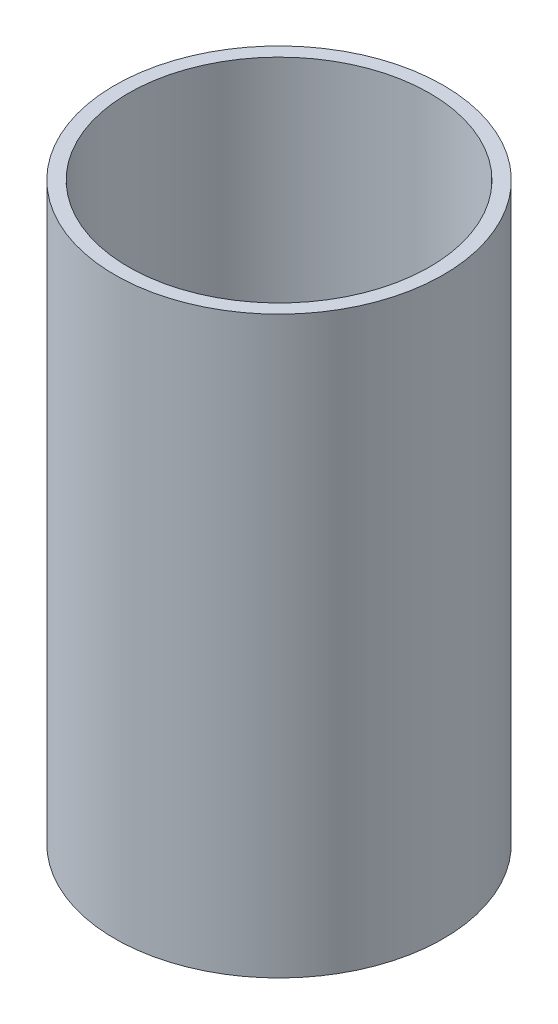
ISO-10303-21;
HEADER;
FILE_DESCRIPTION(('STEP AP214'),'2;1');
FILE_NAME('part.step','',(''),(''),'','','');
FILE_SCHEMA(('AUTOMOTIVE_DESIGN { 1 0 10303 214 1 1 1 1 }'));
ENDSEC;
DATA;
#1=APPLICATION_CONTEXT('core data for automotive mechanical design processes');
#2=APPLICATION_PROTOCOL_DEFINITION('international standard','automotive_design',2000,#1);
#3=PRODUCT_CONTEXT('',#1,'mechanical');
#4=PRODUCT('Part','Part','',(#3));
#5=PRODUCT_RELATED_PRODUCT_CATEGORY('part','',(#4));
#6=PRODUCT_DEFINITION_FORMATION('','',#4);
#7=PRODUCT_DEFINITION_CONTEXT('part definition',#1,'design');
#8=PRODUCT_DEFINITION('design','',#6,#7);
#9=PRODUCT_DEFINITION_SHAPE('','',#8);
#10=(LENGTH_UNIT() NAMED_UNIT(*) SI_UNIT(.MILLI.,.METRE.));
#11=(NAMED_UNIT(*) PLANE_ANGLE_UNIT() SI_UNIT($,.RADIAN.));
#12=(NAMED_UNIT(*) SI_UNIT($,.STERADIAN.) SOLID_ANGLE_UNIT());
#13=UNCERTAINTY_MEASURE_WITH_UNIT(LENGTH_MEASURE(1.E-05),#10,'distance_accuracy_value','');
#14=(GEOMETRIC_REPRESENTATION_CONTEXT(3) GLOBAL_UNCERTAINTY_ASSIGNED_CONTEXT((#13)) GLOBAL_UNIT_ASSIGNED_CONTEXT((#10,
#11,#12)) REPRESENTATION_CONTEXT('',''));
#15=CARTESIAN_POINT('',(0.,0.,0.));
#16=DIRECTION('',(0.,0.,1.));
#17=DIRECTION('',(1.,0.,0.));
#18=AXIS2_PLACEMENT_3D('',#15,#16,#17);
#19=CARTESIAN_POINT('',(0.,21.,0.));
#20=DIRECTION('',(0.,1.,0.));
#21=DIRECTION('',(0.,0.,1.));
#22=AXIS2_PLACEMENT_3D('',#19,#20,#21);
#23=PLANE('',#22);
#24=CARTESIAN_POINT('',(0.,21.,0.));
#25=DIRECTION('',(0.,1.,0.));
#26=DIRECTION('',(0.,0.,1.));
#27=AXIS2_PLACEMENT_3D('',#24,#25,#26);
#28=CIRCLE('',#27,12.);
#29=CARTESIAN_POINT('',(0.,21.,-12.));
#30=VERTEX_POINT('',#29);
#31=EDGE_CURVE('E10',#30,#30,#28,.T.);
#32=ORIENTED_EDGE('',*,*,#31,.T.);
#33=EDGE_LOOP('',(#32));
#34=FACE_BOUND('',#33,.T.);
#35=CARTESIAN_POINT('',(0.,21.,0.));
#36=DIRECTION('',(0.,1.,0.));
#37=DIRECTION('',(0.,0.,1.));
#38=AXIS2_PLACEMENT_3D('',#35,#36,#37);
#39=CIRCLE('',#38,11.);
#40=CARTESIAN_POINT('',(0.,21.,-11.));
#41=VERTEX_POINT('',#40);
#42=EDGE_CURVE('E52',#41,#41,#39,.T.);
#43=ORIENTED_EDGE('',*,*,#42,.F.);
#44=EDGE_LOOP('',(#43));
#45=FACE_BOUND('',#44,.T.);
#46=ADVANCED_FACE('F41',(#34,#45),#23,.T.);
#47=CARTESIAN_POINT('',(0.,-21.,0.));
#48=DIRECTION('',(0.,1.,0.));
#49=DIRECTION('',(0.,0.,1.));
#50=AXIS2_PLACEMENT_3D('',#47,#48,#49);
#51=PLANE('',#50);
#52=CARTESIAN_POINT('',(0.,-21.,0.));
#53=DIRECTION('',(0.,1.,0.));
#54=DIRECTION('',(0.,0.,1.));
#55=AXIS2_PLACEMENT_3D('',#52,#53,#54);
#56=CIRCLE('',#55,12.);
#57=CARTESIAN_POINT('',(0.,-21.,-12.));
#58=VERTEX_POINT('',#57);
#59=EDGE_CURVE('E45',#58,#58,#56,.T.);
#60=ORIENTED_EDGE('',*,*,#59,.F.);
#61=EDGE_LOOP('',(#60));
#62=FACE_BOUND('',#61,.T.);
#63=CARTESIAN_POINT('',(0.,-21.,0.));
#64=DIRECTION('',(0.,1.,0.));
#65=DIRECTION('',(0.,0.,1.));
#66=AXIS2_PLACEMENT_3D('',#63,#64,#65);
#67=CIRCLE('',#66,11.);
#68=CARTESIAN_POINT('',(0.,-21.,-11.));
#69=VERTEX_POINT('',#68);
#70=EDGE_CURVE('E54',#69,#69,#67,.T.);
#71=ORIENTED_EDGE('',*,*,#70,.T.);
#72=EDGE_LOOP('',(#71));
#73=FACE_BOUND('',#72,.T.);
#74=ADVANCED_FACE('F64',(#62,#73),#51,.F.);
#75=CARTESIAN_POINT('',(0.,21.,0.));
#76=DIRECTION('',(0.,-1.,0.));
#77=DIRECTION('',(0.,0.,-1.));
#78=AXIS2_PLACEMENT_3D('',#75,#76,#77);
#79=CYLINDRICAL_SURFACE('',#78,12.);
#80=CARTESIAN_POINT('',(0.,21.,-12.));
#81=CARTESIAN_POINT('',(0.,20.5625,-12.));
#82=CARTESIAN_POINT('',(0.,20.125,-12.));
#83=CARTESIAN_POINT('',(0.,19.25,-12.));
#84=CARTESIAN_POINT('',(0.,18.8125,-12.));
#85=CARTESIAN_POINT('',(0.,17.9375,-12.));
#86=CARTESIAN_POINT('',(0.,17.5,-12.));
#87=CARTESIAN_POINT('',(0.,16.625,-12.));
#88=CARTESIAN_POINT('',(0.,16.1875,-12.));
#89=CARTESIAN_POINT('',(0.,15.3125,-12.));
#90=CARTESIAN_POINT('',(0.,14.875,-12.));
#91=CARTESIAN_POINT('',(0.,14.,-12.));
#92=CARTESIAN_POINT('',(0.,13.5625,-12.));
#93=CARTESIAN_POINT('',(0.,12.6875,-12.));
#94=CARTESIAN_POINT('',(0.,12.25,-12.));
#95=CARTESIAN_POINT('',(0.,11.375,-12.));
#96=CARTESIAN_POINT('',(0.,10.9375,-12.));
#97=CARTESIAN_POINT('',(0.,10.0625,-12.));
#98=CARTESIAN_POINT('',(0.,9.625,-12.));
#99=CARTESIAN_POINT('',(0.,8.75,-12.));
#100=CARTESIAN_POINT('',(0.,8.3125,-12.));
#101=CARTESIAN_POINT('',(0.,7.4375,-12.));
#102=CARTESIAN_POINT('',(0.,7.,-12.));
#103=CARTESIAN_POINT('',(0.,6.125,-12.));
#104=CARTESIAN_POINT('',(0.,5.6875,-12.));
#105=CARTESIAN_POINT('',(0.,4.8125,-12.));
#106=CARTESIAN_POINT('',(0.,4.375,-12.));
#107=CARTESIAN_POINT('',(0.,3.5,-12.));
#108=CARTESIAN_POINT('',(0.,3.0625,-12.));
#109=CARTESIAN_POINT('',(0.,2.1875,-12.));
#110=CARTESIAN_POINT('',(0.,1.75,-12.));
#111=CARTESIAN_POINT('',(0.,0.874999999999997,-12.));
#112=CARTESIAN_POINT('',(0.,0.437499999999997,-12.));
#113=CARTESIAN_POINT('',(0.,-0.437500000000004,-12.));
#114=CARTESIAN_POINT('',(0.,-0.875000000000004,-12.));
#115=CARTESIAN_POINT('',(0.,-1.75000000000001,-12.));
#116=CARTESIAN_POINT('',(0.,-2.18750000000001,-12.));
#117=CARTESIAN_POINT('',(0.,-3.0625,-12.));
#118=CARTESIAN_POINT('',(0.,-3.5,-12.));
#119=CARTESIAN_POINT('',(0.,-4.375,-12.));
#120=CARTESIAN_POINT('',(0.,-4.8125,-12.));
#121=CARTESIAN_POINT('',(0.,-5.68750000000001,-12.));
#122=CARTESIAN_POINT('',(0.,-6.12500000000001,-12.));
#123=CARTESIAN_POINT('',(0.,-7.00000000000001,-12.));
#124=CARTESIAN_POINT('',(0.,-7.4375,-12.));
#125=CARTESIAN_POINT('',(0.,-8.3125,-12.));
#126=CARTESIAN_POINT('',(0.,-8.75,-12.));
#127=CARTESIAN_POINT('',(0.,-9.625,-12.));
#128=CARTESIAN_POINT('',(0.,-10.0625,-12.));
#129=CARTESIAN_POINT('',(0.,-10.9375,-12.));
#130=CARTESIAN_POINT('',(0.,-11.375,-12.));
#131=CARTESIAN_POINT('',(0.,-12.25,-12.));
#132=CARTESIAN_POINT('',(0.,-12.6875,-12.));
#133=CARTESIAN_POINT('',(0.,-13.5625,-12.));
#134=CARTESIAN_POINT('',(0.,-14.,-12.));
#135=CARTESIAN_POINT('',(0.,-14.875,-12.));
#136=CARTESIAN_POINT('',(0.,-15.3125,-12.));
#137=CARTESIAN_POINT('',(0.,-16.1875,-12.));
#138=CARTESIAN_POINT('',(0.,-16.625,-12.));
#139=CARTESIAN_POINT('',(0.,-17.5,-12.));
#140=CARTESIAN_POINT('',(0.,-17.9375,-12.));
#141=CARTESIAN_POINT('',(0.,-18.8125,-12.));
#142=CARTESIAN_POINT('',(0.,-19.25,-12.));
#143=CARTESIAN_POINT('',(0.,-20.125,-12.));
#144=CARTESIAN_POINT('',(0.,-20.5625,-12.));
#145=CARTESIAN_POINT('',(0.,-21.,-12.));
#146=B_SPLINE_CURVE_WITH_KNOTS('',3,(#80,#81,#82,#83,#84,#85,#86,#87,#88,#89,#90,#91,#92,#93,
#94,#95,#96,#97,#98,#99,#100,#101,#102,#103,#104,#105,#106,#107,#108,#109,#110,#111,#112,#113,
#114,#115,#116,#117,#118,#119,#120,#121,#122,#123,#124,#125,#126,#127,#128,#129,#130,#131,#132,
#133,#134,#135,#136,#137,#138,#139,#140,#141,#142,#143,#144,#145),.UNSPECIFIED.,.F.,.F.,(4,2,2,
2,2,2,2,2,2,2,2,2,2,2,2,2,2,2,2,2,2,2,2,2,2,2,2,2,2,2,2,2,4),(0.,1.3125,2.625,3.9375,5.25,
6.5625,7.875,9.1875,10.5,11.8125,13.125,14.4375,15.75,17.0625,18.375,19.6875,21.,22.3125,23.625,
24.9375,26.25,27.5625,28.875,30.1875,31.5,32.8125,34.125,35.4375,36.75,38.0625,39.375,40.6875,
42.),.UNSPECIFIED.);
#147=EDGE_CURVE('BSEAM43',#30,#58,#146,.T.);
#148=ORIENTED_EDGE('',*,*,#31,.F.);
#149=ORIENTED_EDGE('',*,*,#59,.T.);
#150=ORIENTED_EDGE('',*,*,#147,.T.);
#151=ORIENTED_EDGE('',*,*,#147,.F.);
#152=EDGE_LOOP('',(#148,#150,#149,#151));
#153=FACE_BOUND('',#152,.T.);
#154=ADVANCED_FACE('F43',(#153),#79,.T.);
#155=CARTESIAN_POINT('',(0.,21.,0.));
#156=DIRECTION('',(0.,-1.,0.));
#157=DIRECTION('',(0.,0.,-1.));
#158=AXIS2_PLACEMENT_3D('',#155,#156,#157);
#159=CYLINDRICAL_SURFACE('',#158,11.);
#160=CARTESIAN_POINT('',(0.,21.,-11.));
#161=CARTESIAN_POINT('',(0.,20.5625,-11.));
#162=CARTESIAN_POINT('',(0.,20.125,-11.));
#163=CARTESIAN_POINT('',(0.,19.25,-11.));
#164=CARTESIAN_POINT('',(0.,18.8125,-11.));
#165=CARTESIAN_POINT('',(0.,17.9375,-11.));
#166=CARTESIAN_POINT('',(0.,17.5,-11.));
#167=CARTESIAN_POINT('',(0.,16.625,-11.));
#168=CARTESIAN_POINT('',(0.,16.1875,-11.));
#169=CARTESIAN_POINT('',(0.,15.3125,-11.));
#170=CARTESIAN_POINT('',(0.,14.875,-11.));
#171=CARTESIAN_POINT('',(0.,14.,-11.));
#172=CARTESIAN_POINT('',(0.,13.5625,-11.));
#173=CARTESIAN_POINT('',(0.,12.6875,-11.));
#174=CARTESIAN_POINT('',(0.,12.25,-11.));
#175=CARTESIAN_POINT('',(0.,11.375,-11.));
#176=CARTESIAN_POINT('',(0.,10.9375,-11.));
#177=CARTESIAN_POINT('',(0.,10.0625,-11.));
#178=CARTESIAN_POINT('',(0.,9.625,-11.));
#179=CARTESIAN_POINT('',(0.,8.75,-11.));
#180=CARTESIAN_POINT('',(0.,8.3125,-11.));
#181=CARTESIAN_POINT('',(0.,7.4375,-11.));
#182=CARTESIAN_POINT('',(0.,7.,-11.));
#183=CARTESIAN_POINT('',(0.,6.125,-11.));
#184=CARTESIAN_POINT('',(0.,5.6875,-11.));
#185=CARTESIAN_POINT('',(0.,4.8125,-11.));
#186=CARTESIAN_POINT('',(0.,4.375,-11.));
#187=CARTESIAN_POINT('',(0.,3.5,-11.));
#188=CARTESIAN_POINT('',(0.,3.0625,-11.));
#189=CARTESIAN_POINT('',(0.,2.1875,-11.));
#190=CARTESIAN_POINT('',(0.,1.75,-11.));
#191=CARTESIAN_POINT('',(0.,0.875000000000001,-11.));
#192=CARTESIAN_POINT('',(0.,0.4375,-11.));
#193=CARTESIAN_POINT('',(0.,-0.4375,-11.));
#194=CARTESIAN_POINT('',(0.,-0.875000000000001,-11.));
#195=CARTESIAN_POINT('',(0.,-1.75,-11.));
#196=CARTESIAN_POINT('',(0.,-2.1875,-11.));
#197=CARTESIAN_POINT('',(0.,-3.0625,-11.));
#198=CARTESIAN_POINT('',(0.,-3.5,-11.));
#199=CARTESIAN_POINT('',(0.,-4.375,-11.));
#200=CARTESIAN_POINT('',(0.,-4.8125,-11.));
#201=CARTESIAN_POINT('',(0.,-5.6875,-11.));
#202=CARTESIAN_POINT('',(0.,-6.125,-11.));
#203=CARTESIAN_POINT('',(0.,-7.,-11.));
#204=CARTESIAN_POINT('',(0.,-7.4375,-11.));
#205=CARTESIAN_POINT('',(0.,-8.3125,-11.));
#206=CARTESIAN_POINT('',(0.,-8.75,-11.));
#207=CARTESIAN_POINT('',(0.,-9.625,-11.));
#208=CARTESIAN_POINT('',(0.,-10.0625,-11.));
#209=CARTESIAN_POINT('',(0.,-10.9375,-11.));
#210=CARTESIAN_POINT('',(0.,-11.375,-11.));
#211=CARTESIAN_POINT('',(0.,-12.25,-11.));
#212=CARTESIAN_POINT('',(0.,-12.6875,-11.));
#213=CARTESIAN_POINT('',(0.,-13.5625,-11.));
#214=CARTESIAN_POINT('',(0.,-14.,-11.));
#215=CARTESIAN_POINT('',(0.,-14.875,-11.));
#216=CARTESIAN_POINT('',(0.,-15.3125,-11.));
#217=CARTESIAN_POINT('',(0.,-16.1875,-11.));
#218=CARTESIAN_POINT('',(0.,-16.625,-11.));
#219=CARTESIAN_POINT('',(0.,-17.5,-11.));
#220=CARTESIAN_POINT('',(0.,-17.9375,-11.));
#221=CARTESIAN_POINT('',(0.,-18.8125,-11.));
#222=CARTESIAN_POINT('',(0.,-19.25,-11.));
#223=CARTESIAN_POINT('',(0.,-20.125,-11.));
#224=CARTESIAN_POINT('',(0.,-20.5625,-11.));
#225=CARTESIAN_POINT('',(0.,-21.,-11.));
#226=B_SPLINE_CURVE_WITH_KNOTS('',3,(#160,#161,#162,#163,#164,#165,#166,#167,#168,#169,#170,
#171,#172,#173,#174,#175,#176,#177,#178,#179,#180,#181,#182,#183,#184,#185,#186,#187,#188,#189,
#190,#191,#192,#193,#194,#195,#196,#197,#198,#199,#200,#201,#202,#203,#204,#205,#206,#207,#208,
#209,#210,#211,#212,#213,#214,#215,#216,#217,#218,#219,#220,#221,#222,#223,#224,#225),
.UNSPECIFIED.,.F.,.F.,(4,2,2,2,2,2,2,2,2,2,2,2,2,2,2,2,2,2,2,2,2,2,2,2,2,2,2,2,2,2,2,2,4),(0.,
1.3125,2.625,3.9375,5.25,6.5625,7.875,9.1875,10.5,11.8125,13.125,14.4375,15.75,17.0625,18.375,
19.6875,21.,22.3125,23.625,24.9375,26.25,27.5625,28.875,30.1875,31.5,32.8125,34.125,35.4375,
36.75,38.0625,39.375,40.6875,42.),.UNSPECIFIED.);
#227=EDGE_CURVE('BSEAM60',#41,#69,#226,.T.);
#228=ORIENTED_EDGE('',*,*,#42,.T.);
#229=ORIENTED_EDGE('',*,*,#70,.F.);
#230=ORIENTED_EDGE('',*,*,#227,.T.);
#231=ORIENTED_EDGE('',*,*,#227,.F.);
#232=EDGE_LOOP('',(#228,#230,#229,#231));
#233=FACE_BOUND('',#232,.T.);
#234=ADVANCED_FACE('F60',(#233),#159,.F.);
#235=CLOSED_SHELL('',(#46,#74,#154,#234));
#236=MANIFOLD_SOLID_BREP('B2',#235);
#237=ADVANCED_BREP_SHAPE_REPRESENTATION('',(#18,#236),#14);
#238=SHAPE_DEFINITION_REPRESENTATION(#9,#237);
ENDSEC;
END-ISO-10303-21;
